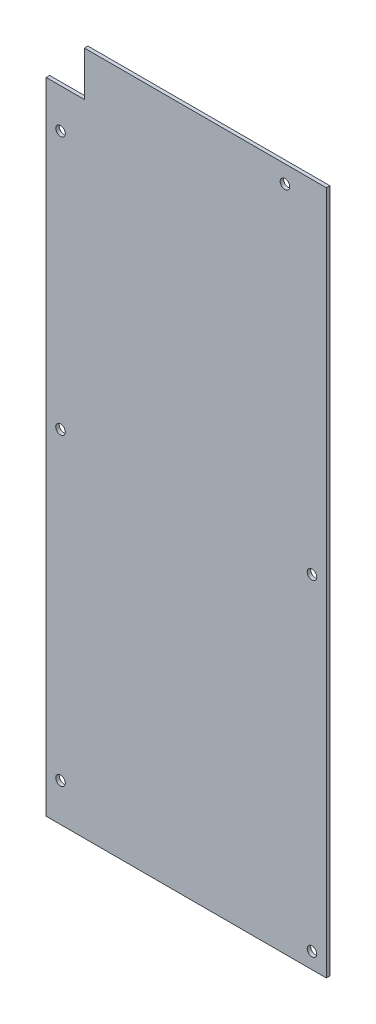
ISO-10303-21;
HEADER;
FILE_DESCRIPTION(('STEP AP214'),'2;1');
FILE_NAME('part.step','',(''),(''),'','','');
FILE_SCHEMA(('AUTOMOTIVE_DESIGN { 1 0 10303 214 1 1 1 1 }'));
ENDSEC;
DATA;
#1=APPLICATION_CONTEXT('core data for automotive mechanical design processes');
#2=APPLICATION_PROTOCOL_DEFINITION('international standard','automotive_design',2000,#1);
#3=PRODUCT_CONTEXT('',#1,'mechanical');
#4=PRODUCT('Part','Part','',(#3));
#5=PRODUCT_RELATED_PRODUCT_CATEGORY('part','',(#4));
#6=PRODUCT_DEFINITION_FORMATION('','',#4);
#7=PRODUCT_DEFINITION_CONTEXT('part definition',#1,'design');
#8=PRODUCT_DEFINITION('design','',#6,#7);
#9=PRODUCT_DEFINITION_SHAPE('','',#8);
#10=(LENGTH_UNIT() NAMED_UNIT(*) SI_UNIT(.MILLI.,.METRE.));
#11=(NAMED_UNIT(*) PLANE_ANGLE_UNIT() SI_UNIT($,.RADIAN.));
#12=(NAMED_UNIT(*) SI_UNIT($,.STERADIAN.) SOLID_ANGLE_UNIT());
#13=UNCERTAINTY_MEASURE_WITH_UNIT(LENGTH_MEASURE(1.E-05),#10,'distance_accuracy_value','');
#14=(GEOMETRIC_REPRESENTATION_CONTEXT(3) GLOBAL_UNCERTAINTY_ASSIGNED_CONTEXT((#13)) GLOBAL_UNIT_ASSIGNED_CONTEXT((#10,
#11,#12)) REPRESENTATION_CONTEXT('',''));
#15=CARTESIAN_POINT('',(0.,0.,0.));
#16=DIRECTION('',(0.,0.,1.));
#17=DIRECTION('',(1.,0.,0.));
#18=AXIS2_PLACEMENT_3D('',#15,#16,#17);
#19=CARTESIAN_POINT('',(-43.4054880311596,36.5751828079822,1.1));
#20=DIRECTION('',(1.,0.,0.));
#21=DIRECTION('',(0.,0.,-1.));
#22=AXIS2_PLACEMENT_3D('',#19,#20,#21);
#23=PLANE('',#22);
#24=DIRECTION('',(0.,-1.,0.));
#25=VECTOR('',#24,1.);
#26=CARTESIAN_POINT('',(-43.4054880311596,36.5751828079822,1.1));
#27=LINE('',#26,#25);
#28=CARTESIAN_POINT('',(-43.4054880311596,22.5761319376729,1.1));
#29=VERTEX_POINT('',#28);
#30=CARTESIAN_POINT('',(-43.4054880311596,-178.424817192018,1.1));
#31=VERTEX_POINT('',#30);
#32=EDGE_CURVE('E86',#29,#31,#27,.T.);
#33=ORIENTED_EDGE('',*,*,#32,.F.);
#34=DIRECTION('',(0.,0.,1.));
#35=VECTOR('',#34,1.);
#36=CARTESIAN_POINT('',(-43.4054880311596,22.5761319376729,0.));
#37=LINE('',#36,#35);
#38=CARTESIAN_POINT('',(-43.4054880311596,22.5761319376729,0.));
#39=VERTEX_POINT('',#38);
#40=EDGE_CURVE('E104',#39,#29,#37,.T.);
#41=ORIENTED_EDGE('',*,*,#40,.F.);
#42=DIRECTION('',(0.,-1.,0.));
#43=VECTOR('',#42,1.);
#44=CARTESIAN_POINT('',(-43.4054880311596,36.5751828079822,0.));
#45=LINE('',#44,#43);
#46=CARTESIAN_POINT('',(-43.4054880311596,-178.424817192018,0.));
#47=VERTEX_POINT('',#46);
#48=EDGE_CURVE('E112',#39,#47,#45,.T.);
#49=ORIENTED_EDGE('',*,*,#48,.T.);
#50=DIRECTION('',(0.,0.,-1.));
#51=VECTOR('',#50,1.);
#52=CARTESIAN_POINT('',(-43.4054880311596,-178.424817192018,1.1));
#53=LINE('',#52,#51);
#54=EDGE_CURVE('E12',#31,#47,#53,.T.);
#55=ORIENTED_EDGE('',*,*,#54,.F.);
#56=EDGE_LOOP('',(#33,#41,#49,#55));
#57=FACE_BOUND('',#56,.T.);
#58=ADVANCED_FACE('F39',(#57),#23,.F.);
#59=CARTESIAN_POINT('',(-43.4054880311596,-178.424817192018,1.1));
#60=DIRECTION('',(0.,1.,0.));
#61=DIRECTION('',(-1.,0.,0.));
#62=AXIS2_PLACEMENT_3D('',#59,#60,#61);
#63=PLANE('',#62);
#64=DIRECTION('',(1.,0.,0.));
#65=VECTOR('',#64,1.);
#66=CARTESIAN_POINT('',(-43.4054880311596,-178.424817192018,0.));
#67=LINE('',#66,#65);
#68=CARTESIAN_POINT('',(44.5945119688404,-178.424817192018,0.));
#69=VERTEX_POINT('',#68);
#70=EDGE_CURVE('E117',#47,#69,#67,.T.);
#71=ORIENTED_EDGE('',*,*,#70,.T.);
#72=DIRECTION('',(0.,0.,-1.));
#73=VECTOR('',#72,1.);
#74=CARTESIAN_POINT('',(44.5945119688404,-178.424817192018,1.1));
#75=LINE('',#74,#73);
#76=CARTESIAN_POINT('',(44.5945119688404,-178.424817192018,1.1));
#77=VERTEX_POINT('',#76);
#78=EDGE_CURVE('E47',#77,#69,#75,.T.);
#79=ORIENTED_EDGE('',*,*,#78,.F.);
#80=DIRECTION('',(1.,0.,0.));
#81=VECTOR('',#80,1.);
#82=CARTESIAN_POINT('',(-43.4054880311596,-178.424817192018,1.1));
#83=LINE('',#82,#81);
#84=EDGE_CURVE('E142',#31,#77,#83,.T.);
#85=ORIENTED_EDGE('',*,*,#84,.F.);
#86=ORIENTED_EDGE('',*,*,#54,.T.);
#87=EDGE_LOOP('',(#71,#79,#85,#86));
#88=FACE_BOUND('',#87,.T.);
#89=ADVANCED_FACE('F199',(#88),#63,.F.);
#90=CARTESIAN_POINT('',(44.5945119688404,36.5751828079822,1.1));
#91=DIRECTION('',(-1.,0.,0.));
#92=DIRECTION('',(0.,0.,1.));
#93=AXIS2_PLACEMENT_3D('',#90,#91,#92);
#94=PLANE('',#93);
#95=DIRECTION('',(0.,1.,0.));
#96=VECTOR('',#95,1.);
#97=CARTESIAN_POINT('',(44.5945119688404,36.5751828079822,0.));
#98=LINE('',#97,#96);
#99=CARTESIAN_POINT('',(44.5945119688404,36.5751828079822,0.));
#100=VERTEX_POINT('',#99);
#101=EDGE_CURVE('E81',#69,#100,#98,.T.);
#102=ORIENTED_EDGE('',*,*,#101,.T.);
#103=DIRECTION('',(0.,0.,-1.));
#104=VECTOR('',#103,1.);
#105=CARTESIAN_POINT('',(44.5945119688404,36.5751828079822,1.1));
#106=LINE('',#105,#104);
#107=CARTESIAN_POINT('',(44.5945119688404,36.5751828079822,1.1));
#108=VERTEX_POINT('',#107);
#109=EDGE_CURVE('E134',#108,#100,#106,.T.);
#110=ORIENTED_EDGE('',*,*,#109,.F.);
#111=DIRECTION('',(0.,1.,0.));
#112=VECTOR('',#111,1.);
#113=CARTESIAN_POINT('',(44.5945119688404,36.5751828079822,1.1));
#114=LINE('',#113,#112);
#115=EDGE_CURVE('E64',#77,#108,#114,.T.);
#116=ORIENTED_EDGE('',*,*,#115,.F.);
#117=ORIENTED_EDGE('',*,*,#78,.T.);
#118=EDGE_LOOP('',(#102,#110,#116,#117));
#119=FACE_BOUND('',#118,.T.);
#120=ADVANCED_FACE('F136',(#119),#94,.F.);
#121=CARTESIAN_POINT('',(-43.4054880311596,36.5751828079822,1.1));
#122=DIRECTION('',(0.,-1.,0.));
#123=DIRECTION('',(0.,0.,-1.));
#124=AXIS2_PLACEMENT_3D('',#121,#122,#123);
#125=PLANE('',#124);
#126=DIRECTION('',(-1.,0.,0.));
#127=VECTOR('',#126,1.);
#128=CARTESIAN_POINT('',(-43.4054880311596,36.5751828079822,0.));
#129=LINE('',#128,#127);
#130=CARTESIAN_POINT('',(-31.4054880311596,36.5751828079822,0.));
#131=VERTEX_POINT('',#130);
#132=EDGE_CURVE('E125',#100,#131,#129,.T.);
#133=ORIENTED_EDGE('',*,*,#132,.T.);
#134=DIRECTION('',(0.,0.,1.));
#135=VECTOR('',#134,1.);
#136=CARTESIAN_POINT('',(-31.4054880311596,36.5751828079822,0.));
#137=LINE('',#136,#135);
#138=CARTESIAN_POINT('',(-31.4054880311596,36.5751828079822,1.1));
#139=VERTEX_POINT('',#138);
#140=EDGE_CURVE('E151',#131,#139,#137,.T.);
#141=ORIENTED_EDGE('',*,*,#140,.T.);
#142=DIRECTION('',(-1.,0.,0.));
#143=VECTOR('',#142,1.);
#144=CARTESIAN_POINT('',(-43.4054880311596,36.5751828079822,1.1));
#145=LINE('',#144,#143);
#146=EDGE_CURVE('E129',#108,#139,#145,.T.);
#147=ORIENTED_EDGE('',*,*,#146,.F.);
#148=ORIENTED_EDGE('',*,*,#109,.T.);
#149=EDGE_LOOP('',(#133,#141,#147,#148));
#150=FACE_BOUND('',#149,.T.);
#151=ADVANCED_FACE('F150',(#150),#125,.F.);
#152=CARTESIAN_POINT('',(0.,0.,1.1));
#153=DIRECTION('',(0.,0.,1.));
#154=DIRECTION('',(1.,0.,0.));
#155=AXIS2_PLACEMENT_3D('',#152,#153,#154);
#156=PLANE('',#155);
#157=CARTESIAN_POINT('',(40.0945119688406,-173.424817192018,1.1));
#158=DIRECTION('',(0.,0.,1.));
#159=DIRECTION('',(1.,0.,0.));
#160=AXIS2_PLACEMENT_3D('',#157,#158,#159);
#161=CIRCLE('',#160,1.5);
#162=CARTESIAN_POINT('',(41.5945119688406,-173.424817192018,1.1));
#163=VERTEX_POINT('',#162);
#164=EDGE_CURVE('E118',#163,#163,#161,.T.);
#165=ORIENTED_EDGE('',*,*,#164,.F.);
#166=EDGE_LOOP('',(#165));
#167=FACE_BOUND('',#166,.T.);
#168=CARTESIAN_POINT('',(40.0945119688404,-70.9248171920178,1.1));
#169=DIRECTION('',(0.,0.,1.));
#170=DIRECTION('',(1.,0.,0.));
#171=AXIS2_PLACEMENT_3D('',#168,#169,#170);
#172=CIRCLE('',#171,1.5);
#173=CARTESIAN_POINT('',(41.5945119688404,-70.9248171920178,1.1));
#174=VERTEX_POINT('',#173);
#175=EDGE_CURVE('E178',#174,#174,#172,.T.);
#176=ORIENTED_EDGE('',*,*,#175,.F.);
#177=EDGE_LOOP('',(#176));
#178=FACE_BOUND('',#177,.T.);
#179=CARTESIAN_POINT('',(-38.9054880311596,10.2551828079822,1.1));
#180=DIRECTION('',(0.,0.,1.));
#181=DIRECTION('',(1.,0.,0.));
#182=AXIS2_PLACEMENT_3D('',#179,#180,#181);
#183=CIRCLE('',#182,1.50000000000198);
#184=CARTESIAN_POINT('',(-37.4054880311576,10.2551828079822,1.1));
#185=VERTEX_POINT('',#184);
#186=EDGE_CURVE('E176',#185,#185,#183,.T.);
#187=ORIENTED_EDGE('',*,*,#186,.F.);
#188=EDGE_LOOP('',(#187));
#189=FACE_BOUND('',#188,.T.);
#190=CARTESIAN_POINT('',(-38.9054880311596,-70.9248171920178,1.1));
#191=DIRECTION('',(0.,0.,1.));
#192=DIRECTION('',(1.,0.,0.));
#193=AXIS2_PLACEMENT_3D('',#190,#191,#192);
#194=CIRCLE('',#193,1.5);
#195=CARTESIAN_POINT('',(-37.4054880311596,-70.9248171920178,1.1));
#196=VERTEX_POINT('',#195);
#197=EDGE_CURVE('E173',#196,#196,#194,.T.);
#198=ORIENTED_EDGE('',*,*,#197,.F.);
#199=EDGE_LOOP('',(#198));
#200=FACE_BOUND('',#199,.T.);
#201=CARTESIAN_POINT('',(-38.9054880311596,-166.424817192018,1.1));
#202=DIRECTION('',(0.,0.,1.));
#203=DIRECTION('',(1.,0.,0.));
#204=AXIS2_PLACEMENT_3D('',#201,#202,#203);
#205=CIRCLE('',#204,1.5);
#206=CARTESIAN_POINT('',(-37.4054880311596,-166.424817192018,1.1));
#207=VERTEX_POINT('',#206);
#208=EDGE_CURVE('E170',#207,#207,#205,.T.);
#209=ORIENTED_EDGE('',*,*,#208,.F.);
#210=EDGE_LOOP('',(#209));
#211=FACE_BOUND('',#210,.T.);
#212=CARTESIAN_POINT('',(31.5945119688404,31.0751828079823,1.1));
#213=DIRECTION('',(0.,0.,1.));
#214=DIRECTION('',(1.,0.,0.));
#215=AXIS2_PLACEMENT_3D('',#212,#213,#214);
#216=CIRCLE('',#215,1.50000000000098);
#217=CARTESIAN_POINT('',(33.0945119688414,31.0751828079823,1.1));
#218=VERTEX_POINT('',#217);
#219=EDGE_CURVE('E167',#218,#218,#216,.T.);
#220=ORIENTED_EDGE('',*,*,#219,.F.);
#221=EDGE_LOOP('',(#220));
#222=FACE_BOUND('',#221,.T.);
#223=DIRECTION('',(0.,1.,0.));
#224=VECTOR('',#223,1.);
#225=CARTESIAN_POINT('',(-31.4054880311596,0.,1.1));
#226=LINE('',#225,#224);
#227=CARTESIAN_POINT('',(-31.4054880311596,22.5761319376729,1.1));
#228=VERTEX_POINT('',#227);
#229=EDGE_CURVE('E149',#228,#139,#226,.T.);
#230=ORIENTED_EDGE('',*,*,#229,.F.);
#231=DIRECTION('',(1.,0.,0.));
#232=VECTOR('',#231,1.);
#233=CARTESIAN_POINT('',(0.,22.5761319376729,1.1));
#234=LINE('',#233,#232);
#235=EDGE_CURVE('E108',#29,#228,#234,.T.);
#236=ORIENTED_EDGE('',*,*,#235,.F.);
#237=ORIENTED_EDGE('',*,*,#32,.T.);
#238=ORIENTED_EDGE('',*,*,#84,.T.);
#239=ORIENTED_EDGE('',*,*,#115,.T.);
#240=ORIENTED_EDGE('',*,*,#146,.T.);
#241=EDGE_LOOP('',(#230,#236,#237,#238,#239,#240));
#242=FACE_BOUND('',#241,.T.);
#243=ADVANCED_FACE('F148',(#167,#178,#189,#200,#211,#222,#242),#156,.T.);
#244=CARTESIAN_POINT('',(0.,0.,0.));
#245=DIRECTION('',(0.,0.,1.));
#246=DIRECTION('',(1.,0.,0.));
#247=AXIS2_PLACEMENT_3D('',#244,#245,#246);
#248=PLANE('',#247);
#249=CARTESIAN_POINT('',(40.0945119688406,-173.424817192018,0.));
#250=DIRECTION('',(0.,0.,1.));
#251=DIRECTION('',(1.,0.,0.));
#252=AXIS2_PLACEMENT_3D('',#249,#250,#251);
#253=CIRCLE('',#252,1.5);
#254=CARTESIAN_POINT('',(41.5945119688406,-173.424817192018,0.));
#255=VERTEX_POINT('',#254);
#256=EDGE_CURVE('E42',#255,#255,#253,.T.);
#257=ORIENTED_EDGE('',*,*,#256,.T.);
#258=EDGE_LOOP('',(#257));
#259=FACE_BOUND('',#258,.T.);
#260=CARTESIAN_POINT('',(40.0945119688404,-70.9248171920178,0.));
#261=DIRECTION('',(0.,0.,1.));
#262=DIRECTION('',(1.,0.,0.));
#263=AXIS2_PLACEMENT_3D('',#260,#261,#262);
#264=CIRCLE('',#263,1.5);
#265=CARTESIAN_POINT('',(41.5945119688404,-70.9248171920178,0.));
#266=VERTEX_POINT('',#265);
#267=EDGE_CURVE('E252',#266,#266,#264,.T.);
#268=ORIENTED_EDGE('',*,*,#267,.T.);
#269=EDGE_LOOP('',(#268));
#270=FACE_BOUND('',#269,.T.);
#271=CARTESIAN_POINT('',(-38.9054880311596,10.2551828079822,0.));
#272=DIRECTION('',(0.,0.,1.));
#273=DIRECTION('',(1.,0.,0.));
#274=AXIS2_PLACEMENT_3D('',#271,#272,#273);
#275=CIRCLE('',#274,1.50000000000198);
#276=CARTESIAN_POINT('',(-37.4054880311576,10.2551828079822,0.));
#277=VERTEX_POINT('',#276);
#278=EDGE_CURVE('E153',#277,#277,#275,.T.);
#279=ORIENTED_EDGE('',*,*,#278,.T.);
#280=EDGE_LOOP('',(#279));
#281=FACE_BOUND('',#280,.T.);
#282=CARTESIAN_POINT('',(-38.9054880311596,-70.9248171920178,0.));
#283=DIRECTION('',(0.,0.,1.));
#284=DIRECTION('',(1.,0.,0.));
#285=AXIS2_PLACEMENT_3D('',#282,#283,#284);
#286=CIRCLE('',#285,1.5);
#287=CARTESIAN_POINT('',(-37.4054880311596,-70.9248171920178,0.));
#288=VERTEX_POINT('',#287);
#289=EDGE_CURVE('E157',#288,#288,#286,.T.);
#290=ORIENTED_EDGE('',*,*,#289,.T.);
#291=EDGE_LOOP('',(#290));
#292=FACE_BOUND('',#291,.T.);
#293=CARTESIAN_POINT('',(-38.9054880311596,-166.424817192018,0.));
#294=DIRECTION('',(0.,0.,1.));
#295=DIRECTION('',(1.,0.,0.));
#296=AXIS2_PLACEMENT_3D('',#293,#294,#295);
#297=CIRCLE('',#296,1.5);
#298=CARTESIAN_POINT('',(-37.4054880311596,-166.424817192018,0.));
#299=VERTEX_POINT('',#298);
#300=EDGE_CURVE('E245',#299,#299,#297,.T.);
#301=ORIENTED_EDGE('',*,*,#300,.T.);
#302=EDGE_LOOP('',(#301));
#303=FACE_BOUND('',#302,.T.);
#304=CARTESIAN_POINT('',(31.5945119688404,31.0751828079823,-4.3298697960376E-13));
#305=DIRECTION('',(0.,0.,1.));
#306=DIRECTION('',(1.,0.,0.));
#307=AXIS2_PLACEMENT_3D('',#304,#305,#306);
#308=CIRCLE('',#307,1.50000000000098);
#309=CARTESIAN_POINT('',(33.0945119688414,31.0751828079823,-4.3298697960376E-13));
#310=VERTEX_POINT('',#309);
#311=EDGE_CURVE('E248',#310,#310,#308,.T.);
#312=ORIENTED_EDGE('',*,*,#311,.T.);
#313=EDGE_LOOP('',(#312));
#314=FACE_BOUND('',#313,.T.);
#315=DIRECTION('',(1.,0.,0.));
#316=VECTOR('',#315,1.);
#317=CARTESIAN_POINT('',(-43.4054880311596,22.5761319376729,0.));
#318=LINE('',#317,#316);
#319=CARTESIAN_POINT('',(-31.4054880311596,22.5761319376729,0.));
#320=VERTEX_POINT('',#319);
#321=EDGE_CURVE('E101',#39,#320,#318,.T.);
#322=ORIENTED_EDGE('',*,*,#321,.T.);
#323=DIRECTION('',(0.,1.,0.));
#324=VECTOR('',#323,1.);
#325=CARTESIAN_POINT('',(-31.4054880311596,36.5751828079822,0.));
#326=LINE('',#325,#324);
#327=EDGE_CURVE('E114',#320,#131,#326,.T.);
#328=ORIENTED_EDGE('',*,*,#327,.T.);
#329=ORIENTED_EDGE('',*,*,#132,.F.);
#330=ORIENTED_EDGE('',*,*,#101,.F.);
#331=ORIENTED_EDGE('',*,*,#70,.F.);
#332=ORIENTED_EDGE('',*,*,#48,.F.);
#333=EDGE_LOOP('',(#322,#328,#329,#330,#331,#332));
#334=FACE_BOUND('',#333,.T.);
#335=ADVANCED_FACE('F116',(#259,#270,#281,#292,#303,#314,#334),#248,.F.);
#336=CARTESIAN_POINT('',(-31.4054880311596,36.5751828079822,0.));
#337=DIRECTION('',(1.,0.,0.));
#338=DIRECTION('',(0.,0.,-1.));
#339=AXIS2_PLACEMENT_3D('',#336,#337,#338);
#340=PLANE('',#339);
#341=ORIENTED_EDGE('',*,*,#229,.T.);
#342=ORIENTED_EDGE('',*,*,#140,.F.);
#343=ORIENTED_EDGE('',*,*,#327,.F.);
#344=DIRECTION('',(0.,0.,1.));
#345=VECTOR('',#344,1.);
#346=CARTESIAN_POINT('',(-31.4054880311596,22.5761319376729,0.));
#347=LINE('',#346,#345);
#348=EDGE_CURVE('E55',#320,#228,#347,.T.);
#349=ORIENTED_EDGE('',*,*,#348,.T.);
#350=EDGE_LOOP('',(#341,#342,#343,#349));
#351=FACE_BOUND('',#350,.T.);
#352=ADVANCED_FACE('F212',(#351),#340,.F.);
#353=CARTESIAN_POINT('',(-43.4054880311596,22.5761319376729,0.));
#354=DIRECTION('',(0.,-1.,0.));
#355=DIRECTION('',(1.,0.,0.));
#356=AXIS2_PLACEMENT_3D('',#353,#354,#355);
#357=PLANE('',#356);
#358=ORIENTED_EDGE('',*,*,#235,.T.);
#359=ORIENTED_EDGE('',*,*,#348,.F.);
#360=ORIENTED_EDGE('',*,*,#321,.F.);
#361=ORIENTED_EDGE('',*,*,#40,.T.);
#362=EDGE_LOOP('',(#358,#359,#360,#361));
#363=FACE_BOUND('',#362,.T.);
#364=ADVANCED_FACE('F103',(#363),#357,.F.);
#365=CARTESIAN_POINT('',(31.5945119688404,31.0751828079823,-4.3298697960376E-13));
#366=DIRECTION('',(0.,0.,1.));
#367=DIRECTION('',(1.,0.,0.));
#368=AXIS2_PLACEMENT_3D('',#365,#366,#367);
#369=CYLINDRICAL_SURFACE('',#368,1.50000000000098);
#370=ORIENTED_EDGE('',*,*,#219,.T.);
#371=EDGE_LOOP('',(#370));
#372=FACE_BOUND('',#371,.T.);
#373=ORIENTED_EDGE('',*,*,#311,.F.);
#374=EDGE_LOOP('',(#373));
#375=FACE_BOUND('',#374,.T.);
#376=ADVANCED_FACE('F217',(#372,#375),#369,.F.);
#377=CARTESIAN_POINT('',(-38.9054880311596,-166.424817192018,0.));
#378=DIRECTION('',(0.,0.,1.));
#379=DIRECTION('',(1.,0.,0.));
#380=AXIS2_PLACEMENT_3D('',#377,#378,#379);
#381=CYLINDRICAL_SURFACE('',#380,1.5);
#382=ORIENTED_EDGE('',*,*,#208,.T.);
#383=EDGE_LOOP('',(#382));
#384=FACE_BOUND('',#383,.T.);
#385=ORIENTED_EDGE('',*,*,#300,.F.);
#386=EDGE_LOOP('',(#385));
#387=FACE_BOUND('',#386,.T.);
#388=ADVANCED_FACE('F222',(#384,#387),#381,.F.);
#389=CARTESIAN_POINT('',(-38.9054880311596,-70.9248171920178,0.));
#390=DIRECTION('',(0.,0.,1.));
#391=DIRECTION('',(1.,0.,0.));
#392=AXIS2_PLACEMENT_3D('',#389,#390,#391);
#393=CYLINDRICAL_SURFACE('',#392,1.5);
#394=ORIENTED_EDGE('',*,*,#197,.T.);
#395=EDGE_LOOP('',(#394));
#396=FACE_BOUND('',#395,.T.);
#397=ORIENTED_EDGE('',*,*,#289,.F.);
#398=EDGE_LOOP('',(#397));
#399=FACE_BOUND('',#398,.T.);
#400=ADVANCED_FACE('F228',(#396,#399),#393,.F.);
#401=CARTESIAN_POINT('',(-38.9054880311596,10.2551828079822,0.));
#402=DIRECTION('',(0.,0.,1.));
#403=DIRECTION('',(1.,0.,0.));
#404=AXIS2_PLACEMENT_3D('',#401,#402,#403);
#405=CYLINDRICAL_SURFACE('',#404,1.50000000000198);
#406=ORIENTED_EDGE('',*,*,#186,.T.);
#407=EDGE_LOOP('',(#406));
#408=FACE_BOUND('',#407,.T.);
#409=ORIENTED_EDGE('',*,*,#278,.F.);
#410=EDGE_LOOP('',(#409));
#411=FACE_BOUND('',#410,.T.);
#412=ADVANCED_FACE('F195',(#408,#411),#405,.F.);
#413=CARTESIAN_POINT('',(40.0945119688404,-70.9248171920178,0.));
#414=DIRECTION('',(0.,0.,1.));
#415=DIRECTION('',(1.,0.,0.));
#416=AXIS2_PLACEMENT_3D('',#413,#414,#415);
#417=CYLINDRICAL_SURFACE('',#416,1.5);
#418=ORIENTED_EDGE('',*,*,#175,.T.);
#419=EDGE_LOOP('',(#418));
#420=FACE_BOUND('',#419,.T.);
#421=ORIENTED_EDGE('',*,*,#267,.F.);
#422=EDGE_LOOP('',(#421));
#423=FACE_BOUND('',#422,.T.);
#424=ADVANCED_FACE('F189',(#420,#423),#417,.F.);
#425=CARTESIAN_POINT('',(40.0945119688406,-173.424817192018,-0.0400520185751729));
#426=DIRECTION('',(0.,0.,1.));
#427=DIRECTION('',(1.,0.,0.));
#428=AXIS2_PLACEMENT_3D('',#425,#426,#427);
#429=CYLINDRICAL_SURFACE('',#428,1.5);
#430=ORIENTED_EDGE('',*,*,#164,.T.);
#431=EDGE_LOOP('',(#430));
#432=FACE_BOUND('',#431,.T.);
#433=ORIENTED_EDGE('',*,*,#256,.F.);
#434=EDGE_LOOP('',(#433));
#435=FACE_BOUND('',#434,.T.);
#436=ADVANCED_FACE('F187',(#432,#435),#429,.F.);
#437=CLOSED_SHELL('',(#58,#89,#120,#151,#243,#335,#352,#364,#376,#388,#400,#412,#424,#436));
#438=MANIFOLD_SOLID_BREP('B2',#437);
#439=ADVANCED_BREP_SHAPE_REPRESENTATION('',(#18,#438),#14);
#440=SHAPE_DEFINITION_REPRESENTATION(#9,#439);
ENDSEC;
END-ISO-10303-21;
